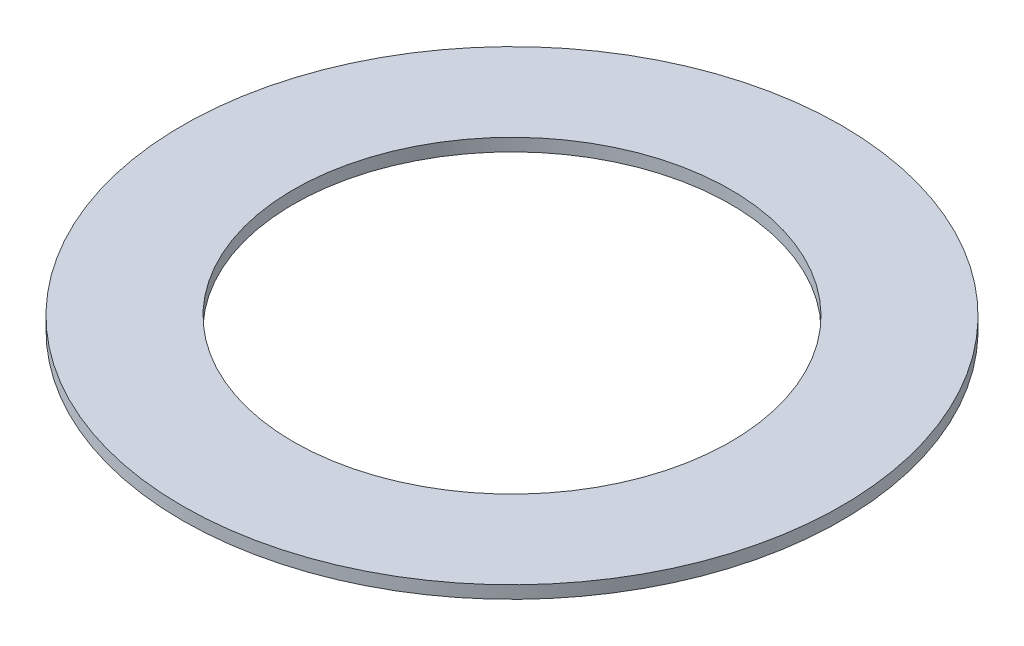
ISO-10303-21;
HEADER;
FILE_DESCRIPTION(('STEP AP214'),'2;1');
FILE_NAME('part.step','',(''),(''),'','','');
FILE_SCHEMA(('AUTOMOTIVE_DESIGN { 1 0 10303 214 1 1 1 1 }'));
ENDSEC;
DATA;
#1=APPLICATION_CONTEXT('core data for automotive mechanical design processes');
#2=APPLICATION_PROTOCOL_DEFINITION('international standard','automotive_design',2000,#1);
#3=PRODUCT_CONTEXT('',#1,'mechanical');
#4=PRODUCT('Part','Part','',(#3));
#5=PRODUCT_RELATED_PRODUCT_CATEGORY('part','',(#4));
#6=PRODUCT_DEFINITION_FORMATION('','',#4);
#7=PRODUCT_DEFINITION_CONTEXT('part definition',#1,'design');
#8=PRODUCT_DEFINITION('design','',#6,#7);
#9=PRODUCT_DEFINITION_SHAPE('','',#8);
#10=(LENGTH_UNIT() NAMED_UNIT(*) SI_UNIT(.MILLI.,.METRE.));
#11=(NAMED_UNIT(*) PLANE_ANGLE_UNIT() SI_UNIT($,.RADIAN.));
#12=(NAMED_UNIT(*) SI_UNIT($,.STERADIAN.) SOLID_ANGLE_UNIT());
#13=UNCERTAINTY_MEASURE_WITH_UNIT(LENGTH_MEASURE(1.E-05),#10,'distance_accuracy_value','');
#14=(GEOMETRIC_REPRESENTATION_CONTEXT(3) GLOBAL_UNCERTAINTY_ASSIGNED_CONTEXT((#13)) GLOBAL_UNIT_ASSIGNED_CONTEXT((#10,
#11,#12)) REPRESENTATION_CONTEXT('',''));
#15=CARTESIAN_POINT('',(0.,0.,0.));
#16=DIRECTION('',(0.,0.,1.));
#17=DIRECTION('',(1.,0.,0.));
#18=AXIS2_PLACEMENT_3D('',#15,#16,#17);
#19=CARTESIAN_POINT('',(0.,3.,0.));
#20=DIRECTION('',(0.,1.,0.));
#21=DIRECTION('',(0.,0.,1.));
#22=AXIS2_PLACEMENT_3D('',#19,#20,#21);
#23=PLANE('',#22);
#24=CARTESIAN_POINT('',(0.,3.,0.));
#25=DIRECTION('',(0.,1.,0.));
#26=DIRECTION('',(0.,0.,1.));
#27=AXIS2_PLACEMENT_3D('',#24,#25,#26);
#28=CIRCLE('',#27,78.35);
#29=CARTESIAN_POINT('',(0.,3.,78.35));
#30=VERTEX_POINT('',#29);
#31=EDGE_CURVE('E10',#30,#30,#28,.T.);
#32=ORIENTED_EDGE('',*,*,#31,.T.);
#33=EDGE_LOOP('',(#32));
#34=FACE_BOUND('',#33,.T.);
#35=CARTESIAN_POINT('',(0.,3.,0.));
#36=DIRECTION('',(0.,1.,0.));
#37=DIRECTION('',(0.,0.,1.));
#38=AXIS2_PLACEMENT_3D('',#35,#36,#37);
#39=CIRCLE('',#38,51.95);
#40=CARTESIAN_POINT('',(0.,3.,51.95));
#41=VERTEX_POINT('',#40);
#42=EDGE_CURVE('E42',#41,#41,#39,.T.);
#43=ORIENTED_EDGE('',*,*,#42,.F.);
#44=EDGE_LOOP('',(#43));
#45=FACE_BOUND('',#44,.T.);
#46=ADVANCED_FACE('F31',(#34,#45),#23,.T.);
#47=CARTESIAN_POINT('',(0.,0.,0.));
#48=DIRECTION('',(0.,1.,0.));
#49=DIRECTION('',(0.,0.,1.));
#50=AXIS2_PLACEMENT_3D('',#47,#48,#49);
#51=PLANE('',#50);
#52=CARTESIAN_POINT('',(0.,0.,0.));
#53=DIRECTION('',(0.,1.,0.));
#54=DIRECTION('',(0.,0.,1.));
#55=AXIS2_PLACEMENT_3D('',#52,#53,#54);
#56=CIRCLE('',#55,78.35);
#57=CARTESIAN_POINT('',(0.,0.,78.35));
#58=VERTEX_POINT('',#57);
#59=EDGE_CURVE('E35',#58,#58,#56,.T.);
#60=ORIENTED_EDGE('',*,*,#59,.F.);
#61=EDGE_LOOP('',(#60));
#62=FACE_BOUND('',#61,.T.);
#63=CARTESIAN_POINT('',(0.,0.,0.));
#64=DIRECTION('',(0.,1.,0.));
#65=DIRECTION('',(0.,0.,1.));
#66=AXIS2_PLACEMENT_3D('',#63,#64,#65);
#67=CIRCLE('',#66,51.95);
#68=CARTESIAN_POINT('',(0.,0.,51.95));
#69=VERTEX_POINT('',#68);
#70=EDGE_CURVE('E44',#69,#69,#67,.T.);
#71=ORIENTED_EDGE('',*,*,#70,.T.);
#72=EDGE_LOOP('',(#71));
#73=FACE_BOUND('',#72,.T.);
#74=ADVANCED_FACE('F54',(#62,#73),#51,.F.);
#75=CARTESIAN_POINT('',(0.,3.,0.));
#76=DIRECTION('',(0.,-1.,0.));
#77=DIRECTION('',(0.,0.,-1.));
#78=AXIS2_PLACEMENT_3D('',#75,#76,#77);
#79=CYLINDRICAL_SURFACE('',#78,78.35);
#80=ORIENTED_EDGE('',*,*,#31,.F.);
#81=EDGE_LOOP('',(#80));
#82=FACE_BOUND('',#81,.T.);
#83=ORIENTED_EDGE('',*,*,#59,.T.);
#84=EDGE_LOOP('',(#83));
#85=FACE_BOUND('',#84,.T.);
#86=ADVANCED_FACE('F33',(#82,#85),#79,.T.);
#87=CARTESIAN_POINT('',(0.,3.,0.));
#88=DIRECTION('',(0.,-1.,0.));
#89=DIRECTION('',(0.,0.,-1.));
#90=AXIS2_PLACEMENT_3D('',#87,#88,#89);
#91=CYLINDRICAL_SURFACE('',#90,51.95);
#92=ORIENTED_EDGE('',*,*,#42,.T.);
#93=EDGE_LOOP('',(#92));
#94=FACE_BOUND('',#93,.T.);
#95=ORIENTED_EDGE('',*,*,#70,.F.);
#96=EDGE_LOOP('',(#95));
#97=FACE_BOUND('',#96,.T.);
#98=ADVANCED_FACE('F50',(#94,#97),#91,.F.);
#99=CLOSED_SHELL('',(#46,#74,#86,#98));
#100=MANIFOLD_SOLID_BREP('B2',#99);
#101=ADVANCED_BREP_SHAPE_REPRESENTATION('',(#18,#100),#14);
#102=SHAPE_DEFINITION_REPRESENTATION(#9,#101);
ENDSEC;
END-ISO-10303-21;
